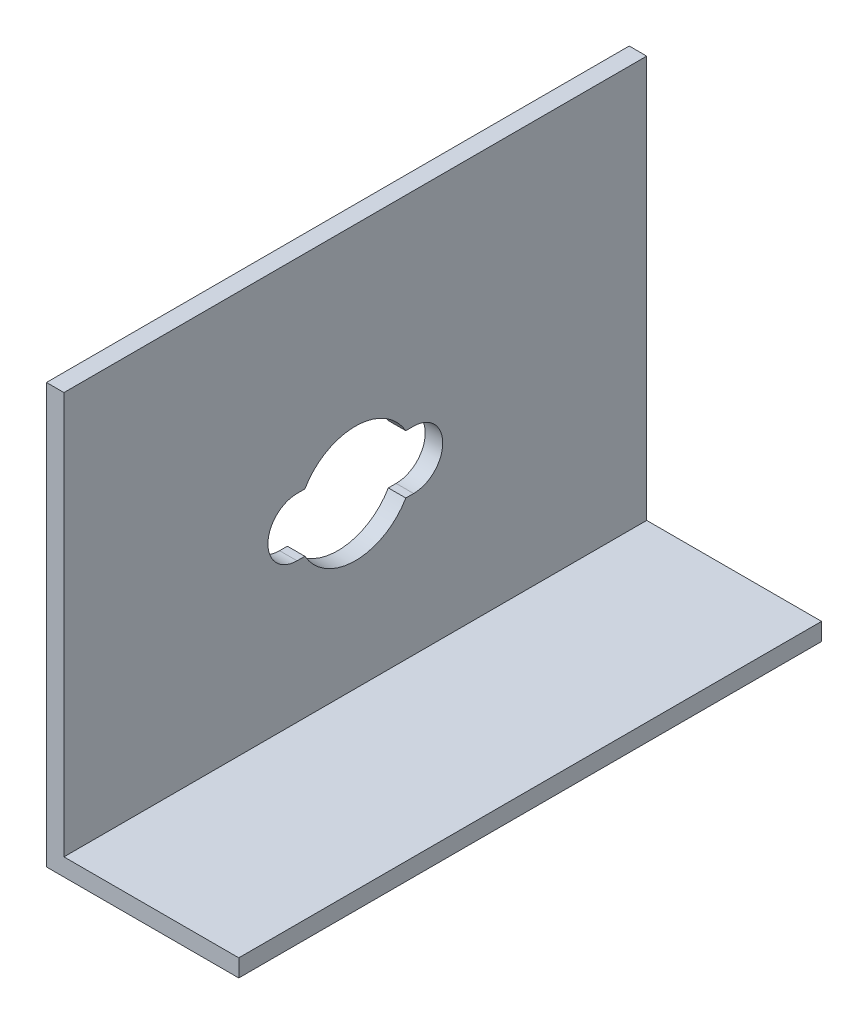
ISO-10303-21;
HEADER;
FILE_DESCRIPTION(('STEP AP214'),'2;1');
FILE_NAME('part.step','',(''),(''),'','','');
FILE_SCHEMA(('AUTOMOTIVE_DESIGN { 1 0 10303 214 1 1 1 1 }'));
ENDSEC;
DATA;
#1=APPLICATION_CONTEXT('core data for automotive mechanical design processes');
#2=APPLICATION_PROTOCOL_DEFINITION('international standard','automotive_design',2000,#1);
#3=PRODUCT_CONTEXT('',#1,'mechanical');
#4=PRODUCT('Part','Part','',(#3));
#5=PRODUCT_RELATED_PRODUCT_CATEGORY('part','',(#4));
#6=PRODUCT_DEFINITION_FORMATION('','',#4);
#7=PRODUCT_DEFINITION_CONTEXT('part definition',#1,'design');
#8=PRODUCT_DEFINITION('design','',#6,#7);
#9=PRODUCT_DEFINITION_SHAPE('','',#8);
#10=(LENGTH_UNIT() NAMED_UNIT(*) SI_UNIT(.MILLI.,.METRE.));
#11=(NAMED_UNIT(*) PLANE_ANGLE_UNIT() SI_UNIT($,.RADIAN.));
#12=(NAMED_UNIT(*) SI_UNIT($,.STERADIAN.) SOLID_ANGLE_UNIT());
#13=UNCERTAINTY_MEASURE_WITH_UNIT(LENGTH_MEASURE(1.E-05),#10,'distance_accuracy_value','');
#14=(GEOMETRIC_REPRESENTATION_CONTEXT(3) GLOBAL_UNCERTAINTY_ASSIGNED_CONTEXT((#13)) GLOBAL_UNIT_ASSIGNED_CONTEXT((#10,
#11,#12)) REPRESENTATION_CONTEXT('',''));
#15=CARTESIAN_POINT('',(0.,0.,0.));
#16=DIRECTION('',(0.,0.,1.));
#17=DIRECTION('',(1.,0.,0.));
#18=AXIS2_PLACEMENT_3D('',#15,#16,#17);
#19=CARTESIAN_POINT('',(3.00000000000001,3.,100.));
#20=DIRECTION('',(-1.,0.,0.));
#21=DIRECTION('',(0.,-1.,0.));
#22=AXIS2_PLACEMENT_3D('',#19,#20,#21);
#23=PLANE('',#22);
#24=DIRECTION('',(0.,0.,-1.));
#25=VECTOR('',#24,1.);
#26=CARTESIAN_POINT('',(3.00000000000001,37.0000000000003,99.9999999999998));
#27=LINE('',#26,#25);
#28=CARTESIAN_POINT('',(3.,37.,41.3397459621556));
#29=VERTEX_POINT('',#28);
#30=CARTESIAN_POINT('',(3.,37.,40.));
#31=VERTEX_POINT('',#30);
#32=EDGE_CURVE('E200',#29,#31,#27,.T.);
#33=ORIENTED_EDGE('',*,*,#32,.T.);
#34=CARTESIAN_POINT('',(3.,32.,40.));
#35=DIRECTION('',(-1.,0.,0.));
#36=DIRECTION('',(0.,-1.,0.));
#37=AXIS2_PLACEMENT_3D('',#34,#35,#36);
#38=CIRCLE('',#37,5.);
#39=CARTESIAN_POINT('',(3.,27.,40.));
#40=VERTEX_POINT('',#39);
#41=EDGE_CURVE('E203',#31,#40,#38,.T.);
#42=ORIENTED_EDGE('',*,*,#41,.T.);
#43=DIRECTION('',(0.,0.,1.));
#44=VECTOR('',#43,1.);
#45=CARTESIAN_POINT('',(3.00000000000001,26.9999999999998,100.));
#46=LINE('',#45,#44);
#47=CARTESIAN_POINT('',(3.00000000000001,27.,41.3397459621556));
#48=VERTEX_POINT('',#47);
#49=EDGE_CURVE('E175',#40,#48,#46,.T.);
#50=ORIENTED_EDGE('',*,*,#49,.T.);
#51=CARTESIAN_POINT('',(3.,32.,50.));
#52=DIRECTION('',(-1.,0.,0.));
#53=DIRECTION('',(0.,-1.,0.));
#54=AXIS2_PLACEMENT_3D('',#51,#52,#53);
#55=CIRCLE('',#54,10.);
#56=CARTESIAN_POINT('',(3.,27.,58.6602540378443));
#57=VERTEX_POINT('',#56);
#58=EDGE_CURVE('E142',#48,#57,#55,.T.);
#59=ORIENTED_EDGE('',*,*,#58,.T.);
#60=DIRECTION('',(0.,0.,1.));
#61=VECTOR('',#60,1.);
#62=CARTESIAN_POINT('',(3.00000000000001,27.0000000000001,99.9999999999999));
#63=LINE('',#62,#61);
#64=CARTESIAN_POINT('',(3.,27.,60.));
#65=VERTEX_POINT('',#64);
#66=EDGE_CURVE('E188',#57,#65,#63,.T.);
#67=ORIENTED_EDGE('',*,*,#66,.T.);
#68=CARTESIAN_POINT('',(3.,32.,60.));
#69=DIRECTION('',(-1.,0.,0.));
#70=DIRECTION('',(0.,-1.,0.));
#71=AXIS2_PLACEMENT_3D('',#68,#69,#70);
#72=CIRCLE('',#71,5.);
#73=CARTESIAN_POINT('',(3.,37.,59.9999999999999));
#74=VERTEX_POINT('',#73);
#75=EDGE_CURVE('E191',#65,#74,#72,.T.);
#76=ORIENTED_EDGE('',*,*,#75,.T.);
#77=DIRECTION('',(0.,0.,-1.));
#78=VECTOR('',#77,1.);
#79=CARTESIAN_POINT('',(3.00000000000001,36.9999999999998,100.));
#80=LINE('',#79,#78);
#81=CARTESIAN_POINT('',(3.,37.,58.6602540378443));
#82=VERTEX_POINT('',#81);
#83=EDGE_CURVE('E194',#74,#82,#80,.T.);
#84=ORIENTED_EDGE('',*,*,#83,.T.);
#85=CARTESIAN_POINT('',(3.,32.,50.));
#86=DIRECTION('',(-1.,0.,0.));
#87=DIRECTION('',(0.,-1.,0.));
#88=AXIS2_PLACEMENT_3D('',#85,#86,#87);
#89=CIRCLE('',#88,10.);
#90=EDGE_CURVE('E197',#82,#29,#89,.T.);
#91=ORIENTED_EDGE('',*,*,#90,.T.);
#92=EDGE_LOOP('',(#33,#42,#50,#59,#67,#76,#84,#91));
#93=FACE_BOUND('',#92,.T.);
#94=DIRECTION('',(0.,1.,0.));
#95=VECTOR('',#94,1.);
#96=CARTESIAN_POINT('',(3.00000000000001,3.,0.));
#97=LINE('',#96,#95);
#98=CARTESIAN_POINT('',(3.00000000000001,3.,0.));
#99=VERTEX_POINT('',#98);
#100=CARTESIAN_POINT('',(3.00000000000001,72.,0.));
#101=VERTEX_POINT('',#100);
#102=EDGE_CURVE('E206',#99,#101,#97,.T.);
#103=ORIENTED_EDGE('',*,*,#102,.T.);
#104=DIRECTION('',(0.,0.,-1.));
#105=VECTOR('',#104,1.);
#106=CARTESIAN_POINT('',(3.00000000000001,72.,100.));
#107=LINE('',#106,#105);
#108=CARTESIAN_POINT('',(3.00000000000001,72.,100.));
#109=VERTEX_POINT('',#108);
#110=EDGE_CURVE('E11',#109,#101,#107,.T.);
#111=ORIENTED_EDGE('',*,*,#110,.F.);
#112=DIRECTION('',(0.,1.,0.));
#113=VECTOR('',#112,1.);
#114=CARTESIAN_POINT('',(3.00000000000001,3.,100.));
#115=LINE('',#114,#113);
#116=CARTESIAN_POINT('',(3.00000000000001,3.,100.));
#117=VERTEX_POINT('',#116);
#118=EDGE_CURVE('E207',#117,#109,#115,.T.);
#119=ORIENTED_EDGE('',*,*,#118,.F.);
#120=DIRECTION('',(0.,0.,-1.));
#121=VECTOR('',#120,1.);
#122=CARTESIAN_POINT('',(3.00000000000001,3.,100.));
#123=LINE('',#122,#121);
#124=EDGE_CURVE('E221',#117,#99,#123,.T.);
#125=ORIENTED_EDGE('',*,*,#124,.T.);
#126=EDGE_LOOP('',(#103,#111,#119,#125));
#127=FACE_BOUND('',#126,.T.);
#128=ADVANCED_FACE('F36',(#93,#127),#23,.F.);
#129=CARTESIAN_POINT('',(0.,72.,100.));
#130=DIRECTION('',(0.,-1.,0.));
#131=DIRECTION('',(0.,0.,-1.));
#132=AXIS2_PLACEMENT_3D('',#129,#130,#131);
#133=PLANE('',#132);
#134=DIRECTION('',(-1.,0.,0.));
#135=VECTOR('',#134,1.);
#136=CARTESIAN_POINT('',(0.,72.,0.));
#137=LINE('',#136,#135);
#138=CARTESIAN_POINT('',(0.,72.,0.));
#139=VERTEX_POINT('',#138);
#140=EDGE_CURVE('E224',#101,#139,#137,.T.);
#141=ORIENTED_EDGE('',*,*,#140,.T.);
#142=DIRECTION('',(0.,0.,-1.));
#143=VECTOR('',#142,1.);
#144=CARTESIAN_POINT('',(0.,72.,100.));
#145=LINE('',#144,#143);
#146=CARTESIAN_POINT('',(0.,72.,100.));
#147=VERTEX_POINT('',#146);
#148=EDGE_CURVE('E43',#147,#139,#145,.T.);
#149=ORIENTED_EDGE('',*,*,#148,.F.);
#150=DIRECTION('',(-1.,0.,0.));
#151=VECTOR('',#150,1.);
#152=CARTESIAN_POINT('',(0.,72.,100.));
#153=LINE('',#152,#151);
#154=EDGE_CURVE('E210',#109,#147,#153,.T.);
#155=ORIENTED_EDGE('',*,*,#154,.F.);
#156=ORIENTED_EDGE('',*,*,#110,.T.);
#157=EDGE_LOOP('',(#141,#149,#155,#156));
#158=FACE_BOUND('',#157,.T.);
#159=ADVANCED_FACE('F269',(#158),#133,.F.);
#160=CARTESIAN_POINT('',(0.,72.,100.));
#161=DIRECTION('',(1.,0.,0.));
#162=DIRECTION('',(0.,1.,0.));
#163=AXIS2_PLACEMENT_3D('',#160,#161,#162);
#164=PLANE('',#163);
#165=DIRECTION('',(0.,0.,1.));
#166=VECTOR('',#165,1.);
#167=CARTESIAN_POINT('',(0.,27.,40.));
#168=LINE('',#167,#166);
#169=CARTESIAN_POINT('',(0.,27.,40.));
#170=VERTEX_POINT('',#169);
#171=CARTESIAN_POINT('',(0.,27.,41.3397459621556));
#172=VERTEX_POINT('',#171);
#173=EDGE_CURVE('E148',#170,#172,#168,.T.);
#174=ORIENTED_EDGE('',*,*,#173,.F.);
#175=CARTESIAN_POINT('',(0.,32.,40.));
#176=DIRECTION('',(-1.,0.,0.));
#177=DIRECTION('',(0.,-1.,0.));
#178=AXIS2_PLACEMENT_3D('',#175,#176,#177);
#179=CIRCLE('',#178,5.);
#180=CARTESIAN_POINT('',(0.,37.,40.));
#181=VERTEX_POINT('',#180);
#182=EDGE_CURVE('E58',#181,#170,#179,.T.);
#183=ORIENTED_EDGE('',*,*,#182,.F.);
#184=DIRECTION('',(0.,0.,-1.));
#185=VECTOR('',#184,1.);
#186=CARTESIAN_POINT('',(0.,37.,40.));
#187=LINE('',#186,#185);
#188=CARTESIAN_POINT('',(0.,37.,41.3397459621556));
#189=VERTEX_POINT('',#188);
#190=EDGE_CURVE('E170',#189,#181,#187,.T.);
#191=ORIENTED_EDGE('',*,*,#190,.F.);
#192=CARTESIAN_POINT('',(0.,32.,50.));
#193=DIRECTION('',(-1.,0.,0.));
#194=DIRECTION('',(0.,-1.,0.));
#195=AXIS2_PLACEMENT_3D('',#192,#193,#194);
#196=CIRCLE('',#195,10.);
#197=CARTESIAN_POINT('',(0.,37.,58.6602540378443));
#198=VERTEX_POINT('',#197);
#199=EDGE_CURVE('E167',#198,#189,#196,.T.);
#200=ORIENTED_EDGE('',*,*,#199,.F.);
#201=DIRECTION('',(0.,0.,-1.));
#202=VECTOR('',#201,1.);
#203=CARTESIAN_POINT('',(0.,37.,58.6602540378443));
#204=LINE('',#203,#202);
#205=CARTESIAN_POINT('',(0.,37.,59.9999999999999));
#206=VERTEX_POINT('',#205);
#207=EDGE_CURVE('E164',#206,#198,#204,.T.);
#208=ORIENTED_EDGE('',*,*,#207,.F.);
#209=CARTESIAN_POINT('',(0.,32.,60.));
#210=DIRECTION('',(-1.,0.,0.));
#211=DIRECTION('',(0.,-1.,0.));
#212=AXIS2_PLACEMENT_3D('',#209,#210,#211);
#213=CIRCLE('',#212,5.);
#214=CARTESIAN_POINT('',(0.,27.,60.));
#215=VERTEX_POINT('',#214);
#216=EDGE_CURVE('E158',#215,#206,#213,.T.);
#217=ORIENTED_EDGE('',*,*,#216,.F.);
#218=DIRECTION('',(0.,0.,1.));
#219=VECTOR('',#218,1.);
#220=CARTESIAN_POINT('',(0.,27.,58.6602540378443));
#221=LINE('',#220,#219);
#222=CARTESIAN_POINT('',(0.,27.,58.6602540378443));
#223=VERTEX_POINT('',#222);
#224=EDGE_CURVE('E156',#223,#215,#221,.T.);
#225=ORIENTED_EDGE('',*,*,#224,.F.);
#226=CARTESIAN_POINT('',(0.,32.,50.));
#227=DIRECTION('',(-1.,0.,0.));
#228=DIRECTION('',(0.,-1.,0.));
#229=AXIS2_PLACEMENT_3D('',#226,#227,#228);
#230=CIRCLE('',#229,10.);
#231=EDGE_CURVE('E139',#172,#223,#230,.T.);
#232=ORIENTED_EDGE('',*,*,#231,.F.);
#233=EDGE_LOOP('',(#174,#183,#191,#200,#208,#217,#225,#232));
#234=FACE_BOUND('',#233,.T.);
#235=DIRECTION('',(0.,-1.,0.));
#236=VECTOR('',#235,1.);
#237=CARTESIAN_POINT('',(0.,72.,0.));
#238=LINE('',#237,#236);
#239=CARTESIAN_POINT('',(0.,0.,0.));
#240=VERTEX_POINT('',#239);
#241=EDGE_CURVE('E226',#139,#240,#238,.T.);
#242=ORIENTED_EDGE('',*,*,#241,.T.);
#243=DIRECTION('',(0.,0.,-1.));
#244=VECTOR('',#243,1.);
#245=CARTESIAN_POINT('',(0.,0.,100.));
#246=LINE('',#245,#244);
#247=CARTESIAN_POINT('',(0.,0.,100.));
#248=VERTEX_POINT('',#247);
#249=EDGE_CURVE('E241',#248,#240,#246,.T.);
#250=ORIENTED_EDGE('',*,*,#249,.F.);
#251=DIRECTION('',(0.,-1.,0.));
#252=VECTOR('',#251,1.);
#253=CARTESIAN_POINT('',(0.,72.,100.));
#254=LINE('',#253,#252);
#255=EDGE_CURVE('E213',#147,#248,#254,.T.);
#256=ORIENTED_EDGE('',*,*,#255,.F.);
#257=ORIENTED_EDGE('',*,*,#148,.T.);
#258=EDGE_LOOP('',(#242,#250,#256,#257));
#259=FACE_BOUND('',#258,.T.);
#260=ADVANCED_FACE('F152',(#234,#259),#164,.F.);
#261=CARTESIAN_POINT('',(0.,0.,100.));
#262=DIRECTION('',(0.,1.,0.));
#263=DIRECTION('',(0.,0.,1.));
#264=AXIS2_PLACEMENT_3D('',#261,#262,#263);
#265=PLANE('',#264);
#266=DIRECTION('',(1.,0.,0.));
#267=VECTOR('',#266,1.);
#268=CARTESIAN_POINT('',(0.,0.,0.));
#269=LINE('',#268,#267);
#270=CARTESIAN_POINT('',(33.,0.,0.));
#271=VERTEX_POINT('',#270);
#272=EDGE_CURVE('E228',#240,#271,#269,.T.);
#273=ORIENTED_EDGE('',*,*,#272,.T.);
#274=DIRECTION('',(0.,0.,-1.));
#275=VECTOR('',#274,1.);
#276=CARTESIAN_POINT('',(33.,0.,100.));
#277=LINE('',#276,#275);
#278=CARTESIAN_POINT('',(33.,0.,100.));
#279=VERTEX_POINT('',#278);
#280=EDGE_CURVE('E238',#279,#271,#277,.T.);
#281=ORIENTED_EDGE('',*,*,#280,.F.);
#282=DIRECTION('',(1.,0.,0.));
#283=VECTOR('',#282,1.);
#284=CARTESIAN_POINT('',(0.,0.,100.));
#285=LINE('',#284,#283);
#286=EDGE_CURVE('E215',#248,#279,#285,.T.);
#287=ORIENTED_EDGE('',*,*,#286,.F.);
#288=ORIENTED_EDGE('',*,*,#249,.T.);
#289=EDGE_LOOP('',(#273,#281,#287,#288));
#290=FACE_BOUND('',#289,.T.);
#291=ADVANCED_FACE('F257',(#290),#265,.F.);
#292=CARTESIAN_POINT('',(33.,0.,100.));
#293=DIRECTION('',(-1.,0.,0.));
#294=DIRECTION('',(0.,0.,1.));
#295=AXIS2_PLACEMENT_3D('',#292,#293,#294);
#296=PLANE('',#295);
#297=DIRECTION('',(0.,1.,0.));
#298=VECTOR('',#297,1.);
#299=CARTESIAN_POINT('',(33.,0.,0.));
#300=LINE('',#299,#298);
#301=CARTESIAN_POINT('',(33.,3.,0.));
#302=VERTEX_POINT('',#301);
#303=EDGE_CURVE('E230',#271,#302,#300,.T.);
#304=ORIENTED_EDGE('',*,*,#303,.T.);
#305=DIRECTION('',(0.,0.,-1.));
#306=VECTOR('',#305,1.);
#307=CARTESIAN_POINT('',(33.,3.,100.));
#308=LINE('',#307,#306);
#309=CARTESIAN_POINT('',(33.,3.,100.));
#310=VERTEX_POINT('',#309);
#311=EDGE_CURVE('E235',#310,#302,#308,.T.);
#312=ORIENTED_EDGE('',*,*,#311,.F.);
#313=DIRECTION('',(0.,1.,0.));
#314=VECTOR('',#313,1.);
#315=CARTESIAN_POINT('',(33.,0.,100.));
#316=LINE('',#315,#314);
#317=EDGE_CURVE('E217',#279,#310,#316,.T.);
#318=ORIENTED_EDGE('',*,*,#317,.F.);
#319=ORIENTED_EDGE('',*,*,#280,.T.);
#320=EDGE_LOOP('',(#304,#312,#318,#319));
#321=FACE_BOUND('',#320,.T.);
#322=ADVANCED_FACE('F261',(#321),#296,.F.);
#323=CARTESIAN_POINT('',(33.,3.,100.));
#324=DIRECTION('',(0.,-1.,0.));
#325=DIRECTION('',(0.,0.,-1.));
#326=AXIS2_PLACEMENT_3D('',#323,#324,#325);
#327=PLANE('',#326);
#328=DIRECTION('',(-1.,0.,0.));
#329=VECTOR('',#328,1.);
#330=CARTESIAN_POINT('',(33.,3.,0.));
#331=LINE('',#330,#329);
#332=EDGE_CURVE('E211',#302,#99,#331,.T.);
#333=ORIENTED_EDGE('',*,*,#332,.T.);
#334=ORIENTED_EDGE('',*,*,#124,.F.);
#335=DIRECTION('',(-1.,0.,0.));
#336=VECTOR('',#335,1.);
#337=CARTESIAN_POINT('',(33.,3.,100.));
#338=LINE('',#337,#336);
#339=EDGE_CURVE('E219',#310,#117,#338,.T.);
#340=ORIENTED_EDGE('',*,*,#339,.F.);
#341=ORIENTED_EDGE('',*,*,#311,.T.);
#342=EDGE_LOOP('',(#333,#334,#340,#341));
#343=FACE_BOUND('',#342,.T.);
#344=ADVANCED_FACE('F272',(#343),#327,.F.);
#345=CARTESIAN_POINT('',(0.,0.,100.));
#346=DIRECTION('',(0.,0.,-1.));
#347=DIRECTION('',(-1.,0.,0.));
#348=AXIS2_PLACEMENT_3D('',#345,#346,#347);
#349=PLANE('',#348);
#350=ORIENTED_EDGE('',*,*,#118,.T.);
#351=ORIENTED_EDGE('',*,*,#154,.T.);
#352=ORIENTED_EDGE('',*,*,#255,.T.);
#353=ORIENTED_EDGE('',*,*,#286,.T.);
#354=ORIENTED_EDGE('',*,*,#317,.T.);
#355=ORIENTED_EDGE('',*,*,#339,.T.);
#356=EDGE_LOOP('',(#350,#351,#352,#353,#354,#355));
#357=FACE_BOUND('',#356,.T.);
#358=ADVANCED_FACE('F265',(#357),#349,.F.);
#359=CARTESIAN_POINT('',(0.,0.,0.));
#360=DIRECTION('',(0.,0.,-1.));
#361=DIRECTION('',(-1.,0.,0.));
#362=AXIS2_PLACEMENT_3D('',#359,#360,#361);
#363=PLANE('',#362);
#364=ORIENTED_EDGE('',*,*,#102,.F.);
#365=ORIENTED_EDGE('',*,*,#332,.F.);
#366=ORIENTED_EDGE('',*,*,#303,.F.);
#367=ORIENTED_EDGE('',*,*,#272,.F.);
#368=ORIENTED_EDGE('',*,*,#241,.F.);
#369=ORIENTED_EDGE('',*,*,#140,.F.);
#370=EDGE_LOOP('',(#364,#365,#366,#367,#368,#369));
#371=FACE_BOUND('',#370,.T.);
#372=ADVANCED_FACE('F252',(#371),#363,.T.);
#373=CARTESIAN_POINT('',(100.,32.,40.));
#374=DIRECTION('',(-1.,0.,0.));
#375=DIRECTION('',(0.,-1.,0.));
#376=AXIS2_PLACEMENT_3D('',#373,#374,#375);
#377=CYLINDRICAL_SURFACE('',#376,5.);
#378=DIRECTION('',(-1.,0.,0.));
#379=VECTOR('',#378,1.);
#380=CARTESIAN_POINT('',(100.,37.,40.));
#381=LINE('',#380,#379);
#382=EDGE_CURVE('E173',#31,#181,#381,.T.);
#383=ORIENTED_EDGE('',*,*,#382,.T.);
#384=ORIENTED_EDGE('',*,*,#182,.T.);
#385=DIRECTION('',(-1.,0.,0.));
#386=VECTOR('',#385,1.);
#387=CARTESIAN_POINT('',(100.,27.,40.));
#388=LINE('',#387,#386);
#389=EDGE_CURVE('E145',#40,#170,#388,.T.);
#390=ORIENTED_EDGE('',*,*,#389,.F.);
#391=ORIENTED_EDGE('',*,*,#41,.F.);
#392=EDGE_LOOP('',(#383,#384,#390,#391));
#393=FACE_BOUND('',#392,.T.);
#394=ADVANCED_FACE('F305',(#393),#377,.F.);
#395=CARTESIAN_POINT('',(100.,37.,40.));
#396=DIRECTION('',(0.,1.,0.));
#397=DIRECTION('',(0.,0.,1.));
#398=AXIS2_PLACEMENT_3D('',#395,#396,#397);
#399=PLANE('',#398);
#400=DIRECTION('',(-1.,0.,0.));
#401=VECTOR('',#400,1.);
#402=CARTESIAN_POINT('',(100.,37.,41.3397459621556));
#403=LINE('',#402,#401);
#404=EDGE_CURVE('E176',#29,#189,#403,.T.);
#405=ORIENTED_EDGE('',*,*,#404,.T.);
#406=ORIENTED_EDGE('',*,*,#190,.T.);
#407=ORIENTED_EDGE('',*,*,#382,.F.);
#408=ORIENTED_EDGE('',*,*,#32,.F.);
#409=EDGE_LOOP('',(#405,#406,#407,#408));
#410=FACE_BOUND('',#409,.T.);
#411=ADVANCED_FACE('F290',(#410),#399,.F.);
#412=CARTESIAN_POINT('',(100.,32.,50.));
#413=DIRECTION('',(-1.,0.,0.));
#414=DIRECTION('',(0.,-1.,0.));
#415=AXIS2_PLACEMENT_3D('',#412,#413,#414);
#416=CYLINDRICAL_SURFACE('',#415,10.);
#417=DIRECTION('',(-1.,0.,0.));
#418=VECTOR('',#417,1.);
#419=CARTESIAN_POINT('',(100.,37.,58.6602540378443));
#420=LINE('',#419,#418);
#421=EDGE_CURVE('E178',#82,#198,#420,.T.);
#422=ORIENTED_EDGE('',*,*,#421,.T.);
#423=ORIENTED_EDGE('',*,*,#199,.T.);
#424=ORIENTED_EDGE('',*,*,#404,.F.);
#425=ORIENTED_EDGE('',*,*,#90,.F.);
#426=EDGE_LOOP('',(#422,#423,#424,#425));
#427=FACE_BOUND('',#426,.T.);
#428=ADVANCED_FACE('F292',(#427),#416,.F.);
#429=CARTESIAN_POINT('',(100.,37.,58.6602540378443));
#430=DIRECTION('',(0.,1.,0.));
#431=DIRECTION('',(0.,0.,1.));
#432=AXIS2_PLACEMENT_3D('',#429,#430,#431);
#433=PLANE('',#432);
#434=DIRECTION('',(-1.,0.,0.));
#435=VECTOR('',#434,1.);
#436=CARTESIAN_POINT('',(100.,37.,59.9999999999999));
#437=LINE('',#436,#435);
#438=EDGE_CURVE('E180',#74,#206,#437,.T.);
#439=ORIENTED_EDGE('',*,*,#438,.T.);
#440=ORIENTED_EDGE('',*,*,#207,.T.);
#441=ORIENTED_EDGE('',*,*,#421,.F.);
#442=ORIENTED_EDGE('',*,*,#83,.F.);
#443=EDGE_LOOP('',(#439,#440,#441,#442));
#444=FACE_BOUND('',#443,.T.);
#445=ADVANCED_FACE('F298',(#444),#433,.F.);
#446=CARTESIAN_POINT('',(100.,32.,60.));
#447=DIRECTION('',(-1.,0.,0.));
#448=DIRECTION('',(0.,-1.,0.));
#449=AXIS2_PLACEMENT_3D('',#446,#447,#448);
#450=CYLINDRICAL_SURFACE('',#449,5.);
#451=DIRECTION('',(-1.,0.,0.));
#452=VECTOR('',#451,1.);
#453=CARTESIAN_POINT('',(100.,27.,60.));
#454=LINE('',#453,#452);
#455=EDGE_CURVE('E182',#65,#215,#454,.T.);
#456=ORIENTED_EDGE('',*,*,#455,.T.);
#457=ORIENTED_EDGE('',*,*,#216,.T.);
#458=ORIENTED_EDGE('',*,*,#438,.F.);
#459=ORIENTED_EDGE('',*,*,#75,.F.);
#460=EDGE_LOOP('',(#456,#457,#458,#459));
#461=FACE_BOUND('',#460,.T.);
#462=ADVANCED_FACE('F301',(#461),#450,.F.);
#463=CARTESIAN_POINT('',(100.,27.,58.6602540378443));
#464=DIRECTION('',(0.,-1.,0.));
#465=DIRECTION('',(0.,0.,-1.));
#466=AXIS2_PLACEMENT_3D('',#463,#464,#465);
#467=PLANE('',#466);
#468=DIRECTION('',(-1.,0.,0.));
#469=VECTOR('',#468,1.);
#470=CARTESIAN_POINT('',(100.,27.,58.6602540378443));
#471=LINE('',#470,#469);
#472=EDGE_CURVE('E144',#57,#223,#471,.T.);
#473=ORIENTED_EDGE('',*,*,#472,.T.);
#474=ORIENTED_EDGE('',*,*,#224,.T.);
#475=ORIENTED_EDGE('',*,*,#455,.F.);
#476=ORIENTED_EDGE('',*,*,#66,.F.);
#477=EDGE_LOOP('',(#473,#474,#475,#476));
#478=FACE_BOUND('',#477,.T.);
#479=ADVANCED_FACE('F304',(#478),#467,.F.);
#480=CARTESIAN_POINT('',(100.,32.,50.));
#481=DIRECTION('',(-1.,0.,0.));
#482=DIRECTION('',(0.,-1.,0.));
#483=AXIS2_PLACEMENT_3D('',#480,#481,#482);
#484=CYLINDRICAL_SURFACE('',#483,10.);
#485=DIRECTION('',(-1.,0.,0.));
#486=VECTOR('',#485,1.);
#487=CARTESIAN_POINT('',(100.,27.,41.3397459621556));
#488=LINE('',#487,#486);
#489=EDGE_CURVE('E50',#48,#172,#488,.T.);
#490=ORIENTED_EDGE('',*,*,#489,.T.);
#491=ORIENTED_EDGE('',*,*,#231,.T.);
#492=ORIENTED_EDGE('',*,*,#472,.F.);
#493=ORIENTED_EDGE('',*,*,#58,.F.);
#494=EDGE_LOOP('',(#490,#491,#492,#493));
#495=FACE_BOUND('',#494,.T.);
#496=ADVANCED_FACE('F136',(#495),#484,.F.);
#497=CARTESIAN_POINT('',(100.,27.,40.));
#498=DIRECTION('',(0.,-1.,0.));
#499=DIRECTION('',(0.,0.,-1.));
#500=AXIS2_PLACEMENT_3D('',#497,#498,#499);
#501=PLANE('',#500);
#502=ORIENTED_EDGE('',*,*,#389,.T.);
#503=ORIENTED_EDGE('',*,*,#173,.T.);
#504=ORIENTED_EDGE('',*,*,#489,.F.);
#505=ORIENTED_EDGE('',*,*,#49,.F.);
#506=EDGE_LOOP('',(#502,#503,#504,#505));
#507=FACE_BOUND('',#506,.T.);
#508=ADVANCED_FACE('F149',(#507),#501,.F.);
#509=CLOSED_SHELL('',(#128,#159,#260,#291,#322,#344,#358,#372,#394,#411,#428,#445,#462,#479,
#496,#508));
#510=MANIFOLD_SOLID_BREP('B2',#509);
#511=ADVANCED_BREP_SHAPE_REPRESENTATION('',(#18,#510),#14);
#512=SHAPE_DEFINITION_REPRESENTATION(#9,#511);
ENDSEC;
END-ISO-10303-21;
